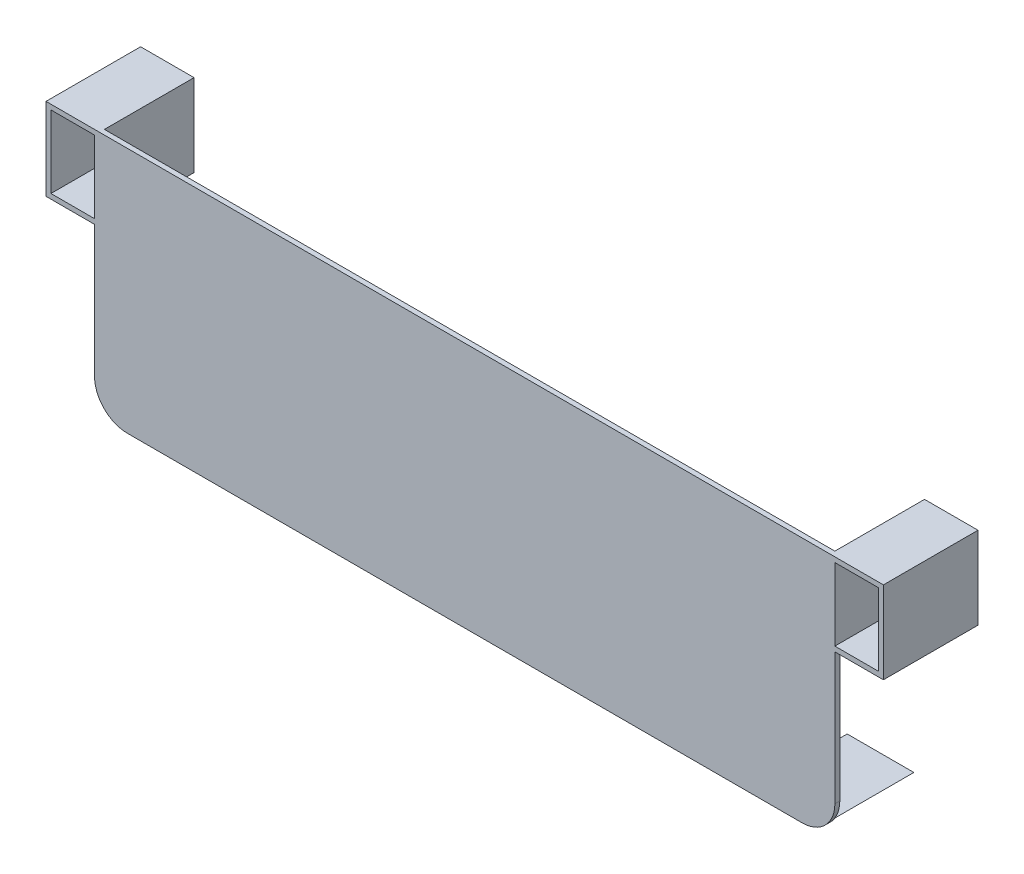
ISO-10303-21;
HEADER;
FILE_DESCRIPTION(('STEP AP214'),'2;1');
FILE_NAME('part.step','',(''),(''),'','','');
FILE_SCHEMA(('AUTOMOTIVE_DESIGN { 1 0 10303 214 1 1 1 1 }'));
ENDSEC;
DATA;
#1=APPLICATION_CONTEXT('core data for automotive mechanical design processes');
#2=APPLICATION_PROTOCOL_DEFINITION('international standard','automotive_design',2000,#1);
#3=PRODUCT_CONTEXT('',#1,'mechanical');
#4=PRODUCT('Part','Part','',(#3));
#5=PRODUCT_RELATED_PRODUCT_CATEGORY('part','',(#4));
#6=PRODUCT_DEFINITION_FORMATION('','',#4);
#7=PRODUCT_DEFINITION_CONTEXT('part definition',#1,'design');
#8=PRODUCT_DEFINITION('design','',#6,#7);
#9=PRODUCT_DEFINITION_SHAPE('','',#8);
#10=(LENGTH_UNIT() NAMED_UNIT(*) SI_UNIT(.MILLI.,.METRE.));
#11=(NAMED_UNIT(*) PLANE_ANGLE_UNIT() SI_UNIT($,.RADIAN.));
#12=(NAMED_UNIT(*) SI_UNIT($,.STERADIAN.) SOLID_ANGLE_UNIT());
#13=UNCERTAINTY_MEASURE_WITH_UNIT(LENGTH_MEASURE(1.E-05),#10,'distance_accuracy_value','');
#14=(GEOMETRIC_REPRESENTATION_CONTEXT(3) GLOBAL_UNCERTAINTY_ASSIGNED_CONTEXT((#13)) GLOBAL_UNIT_ASSIGNED_CONTEXT((#10,
#11,#12)) REPRESENTATION_CONTEXT('',''));
#15=CARTESIAN_POINT('',(0.,0.,0.));
#16=DIRECTION('',(0.,0.,1.));
#17=DIRECTION('',(1.,0.,0.));
#18=AXIS2_PLACEMENT_3D('',#15,#16,#17);
#19=CARTESIAN_POINT('',(-34.8472509170981,0.,1.2));
#20=DIRECTION('',(1.,0.,0.));
#21=DIRECTION('',(0.,1.,0.));
#22=AXIS2_PLACEMENT_3D('',#19,#20,#21);
#23=PLANE('',#22);
#24=DIRECTION('',(0.,-1.,0.));
#25=VECTOR('',#24,1.);
#26=CARTESIAN_POINT('',(-34.8472509170981,0.,1.2));
#27=LINE('',#26,#25);
#28=CARTESIAN_POINT('',(-34.8472509170981,46.7032258064516,1.2));
#29=VERTEX_POINT('',#28);
#30=CARTESIAN_POINT('',(-34.8472509170981,29.1032258064516,1.2));
#31=VERTEX_POINT('',#30);
#32=EDGE_CURVE('E386',#29,#31,#27,.T.);
#33=ORIENTED_EDGE('',*,*,#32,.T.);
#34=DIRECTION('',(0.,0.,1.));
#35=VECTOR('',#34,1.);
#36=CARTESIAN_POINT('',(-34.8472509170981,29.1032258064516,-21.8));
#37=LINE('',#36,#35);
#38=CARTESIAN_POINT('',(-34.8472509170981,29.1032258064516,-21.8));
#39=VERTEX_POINT('',#38);
#40=EDGE_CURVE('E276',#39,#31,#37,.T.);
#41=ORIENTED_EDGE('',*,*,#40,.F.);
#42=DIRECTION('',(0.,-1.,0.));
#43=VECTOR('',#42,1.);
#44=CARTESIAN_POINT('',(-34.8472509170981,46.7032258064516,-21.8));
#45=LINE('',#44,#43);
#46=CARTESIAN_POINT('',(-34.8472509170981,46.7032258064516,-21.8));
#47=VERTEX_POINT('',#46);
#48=EDGE_CURVE('E253',#47,#39,#45,.T.);
#49=ORIENTED_EDGE('',*,*,#48,.F.);
#50=DIRECTION('',(0.,0.,1.));
#51=VECTOR('',#50,1.);
#52=CARTESIAN_POINT('',(-34.8472509170981,46.7032258064516,-21.8));
#53=LINE('',#52,#51);
#54=EDGE_CURVE('E263',#47,#29,#53,.T.);
#55=ORIENTED_EDGE('',*,*,#54,.T.);
#56=EDGE_LOOP('',(#33,#41,#49,#55));
#57=FACE_BOUND('',#56,.T.);
#58=ADVANCED_FACE('F35',(#57),#23,.T.);
#59=CARTESIAN_POINT('',(-214.847250917098,0.,1.2));
#60=DIRECTION('',(1.,0.,0.));
#61=DIRECTION('',(0.,0.,-1.));
#62=AXIS2_PLACEMENT_3D('',#59,#60,#61);
#63=PLANE('',#62);
#64=DIRECTION('',(0.,-1.,0.));
#65=VECTOR('',#64,1.);
#66=CARTESIAN_POINT('',(-214.847250917098,0.,1.2));
#67=LINE('',#66,#65);
#68=CARTESIAN_POINT('',(-214.847250917098,46.7032258064516,1.2));
#69=VERTEX_POINT('',#68);
#70=CARTESIAN_POINT('',(-214.847250917098,29.1032258064516,1.2));
#71=VERTEX_POINT('',#70);
#72=EDGE_CURVE('E392',#69,#71,#67,.T.);
#73=ORIENTED_EDGE('',*,*,#72,.F.);
#74=DIRECTION('',(0.,0.,1.));
#75=VECTOR('',#74,1.);
#76=CARTESIAN_POINT('',(-214.847250917098,46.7032258064516,-21.8));
#77=LINE('',#76,#75);
#78=CARTESIAN_POINT('',(-214.847250917098,46.7032258064516,-21.8));
#79=VERTEX_POINT('',#78);
#80=EDGE_CURVE('E334',#79,#69,#77,.T.);
#81=ORIENTED_EDGE('',*,*,#80,.F.);
#82=DIRECTION('',(0.,1.,0.));
#83=VECTOR('',#82,1.);
#84=CARTESIAN_POINT('',(-214.847250917098,46.7032258064516,-21.8));
#85=LINE('',#84,#83);
#86=CARTESIAN_POINT('',(-214.847250917098,29.1032258064516,-21.8));
#87=VERTEX_POINT('',#86);
#88=EDGE_CURVE('E318',#87,#79,#85,.T.);
#89=ORIENTED_EDGE('',*,*,#88,.F.);
#90=DIRECTION('',(0.,0.,1.));
#91=VECTOR('',#90,1.);
#92=CARTESIAN_POINT('',(-214.847250917098,29.1032258064516,-21.8));
#93=LINE('',#92,#91);
#94=EDGE_CURVE('E336',#87,#71,#93,.T.);
#95=ORIENTED_EDGE('',*,*,#94,.T.);
#96=EDGE_LOOP('',(#73,#81,#89,#95));
#97=FACE_BOUND('',#96,.T.);
#98=ADVANCED_FACE('F505',(#97),#63,.F.);
#99=CARTESIAN_POINT('',(-34.8472509170981,27.9032258064516,1.2));
#100=VERTEX_POINT('',#99);
#101=CARTESIAN_POINT('',(-34.8472509170981,-4.09677419354839,1.2));
#102=VERTEX_POINT('',#101);
#103=EDGE_CURVE('E383',#100,#102,#27,.T.);
#104=ORIENTED_EDGE('',*,*,#103,.T.);
#105=DIRECTION('',(0.,0.,-1.));
#106=VECTOR('',#105,1.);
#107=CARTESIAN_POINT('',(-34.8472509170981,-4.09677419354839,-21.8));
#108=LINE('',#107,#106);
#109=CARTESIAN_POINT('',(-34.8472509170981,-4.09677419354839,0.));
#110=VERTEX_POINT('',#109);
#111=EDGE_CURVE('E423',#102,#110,#108,.T.);
#112=ORIENTED_EDGE('',*,*,#111,.T.);
#113=DIRECTION('',(0.,-1.,0.));
#114=VECTOR('',#113,1.);
#115=CARTESIAN_POINT('',(-34.8472509170981,0.,0.));
#116=LINE('',#115,#114);
#117=CARTESIAN_POINT('',(-34.8472509170981,27.9032258064516,0.));
#118=VERTEX_POINT('',#117);
#119=EDGE_CURVE('E381',#118,#110,#116,.T.);
#120=ORIENTED_EDGE('',*,*,#119,.F.);
#121=DIRECTION('',(0.,0.,-1.));
#122=VECTOR('',#121,1.);
#123=CARTESIAN_POINT('',(-34.8472509170981,27.9032258064516,1.2));
#124=LINE('',#123,#122);
#125=EDGE_CURVE('E299',#100,#118,#124,.T.);
#126=ORIENTED_EDGE('',*,*,#125,.F.);
#127=EDGE_LOOP('',(#104,#112,#120,#126));
#128=FACE_BOUND('',#127,.T.);
#129=ADVANCED_FACE('F468',(#128),#23,.T.);
#130=CARTESIAN_POINT('',(0.,47.9032258064516,1.2));
#131=DIRECTION('',(0.,1.,0.));
#132=DIRECTION('',(0.,0.,1.));
#133=AXIS2_PLACEMENT_3D('',#130,#131,#132);
#134=PLANE('',#133);
#135=DIRECTION('',(1.,0.,0.));
#136=VECTOR('',#135,1.);
#137=CARTESIAN_POINT('',(0.,47.9032258064516,1.2));
#138=LINE('',#137,#136);
#139=CARTESIAN_POINT('',(-226.647250917098,47.9032258064516,1.2));
#140=VERTEX_POINT('',#139);
#141=CARTESIAN_POINT('',(-23.0472509170981,47.9032258064516,1.2));
#142=VERTEX_POINT('',#141);
#143=EDGE_CURVE('E388',#140,#142,#138,.T.);
#144=ORIENTED_EDGE('',*,*,#143,.T.);
#145=DIRECTION('',(0.,0.,1.));
#146=VECTOR('',#145,1.);
#147=CARTESIAN_POINT('',(-23.0472509170981,47.9032258064516,-21.8));
#148=LINE('',#147,#146);
#149=CARTESIAN_POINT('',(-23.0472509170981,47.9032258064516,-21.8));
#150=VERTEX_POINT('',#149);
#151=EDGE_CURVE('E296',#150,#142,#148,.T.);
#152=ORIENTED_EDGE('',*,*,#151,.F.);
#153=DIRECTION('',(-1.,0.,0.));
#154=VECTOR('',#153,1.);
#155=CARTESIAN_POINT('',(-36.0472509170981,47.9032258064516,-21.8));
#156=LINE('',#155,#154);
#157=CARTESIAN_POINT('',(-36.0472509170981,47.9032258064516,-21.8));
#158=VERTEX_POINT('',#157);
#159=EDGE_CURVE('E279',#150,#158,#156,.T.);
#160=ORIENTED_EDGE('',*,*,#159,.T.);
#161=DIRECTION('',(0.,0.,1.));
#162=VECTOR('',#161,1.);
#163=CARTESIAN_POINT('',(-36.0472509170981,47.9032258064516,-21.8));
#164=LINE('',#163,#162);
#165=CARTESIAN_POINT('',(-36.0472509170981,47.9032258064516,0.));
#166=VERTEX_POINT('',#165);
#167=EDGE_CURVE('E292',#158,#166,#164,.T.);
#168=ORIENTED_EDGE('',*,*,#167,.T.);
#169=DIRECTION('',(1.,0.,0.));
#170=VECTOR('',#169,1.);
#171=CARTESIAN_POINT('',(0.,47.9032258064516,0.));
#172=LINE('',#171,#170);
#173=CARTESIAN_POINT('',(-213.647250917098,47.9032258064516,0.));
#174=VERTEX_POINT('',#173);
#175=EDGE_CURVE('E399',#174,#166,#172,.T.);
#176=ORIENTED_EDGE('',*,*,#175,.F.);
#177=DIRECTION('',(0.,0.,1.));
#178=VECTOR('',#177,1.);
#179=CARTESIAN_POINT('',(-213.647250917098,47.9032258064516,-21.8));
#180=LINE('',#179,#178);
#181=CARTESIAN_POINT('',(-213.647250917098,47.9032258064516,-21.8));
#182=VERTEX_POINT('',#181);
#183=EDGE_CURVE('E353',#182,#174,#180,.T.);
#184=ORIENTED_EDGE('',*,*,#183,.F.);
#185=DIRECTION('',(-1.,0.,0.));
#186=VECTOR('',#185,1.);
#187=CARTESIAN_POINT('',(-213.647250917098,47.9032258064516,-21.8));
#188=LINE('',#187,#186);
#189=CARTESIAN_POINT('',(-226.647250917098,47.9032258064516,-21.8));
#190=VERTEX_POINT('',#189);
#191=EDGE_CURVE('E343',#182,#190,#188,.T.);
#192=ORIENTED_EDGE('',*,*,#191,.T.);
#193=DIRECTION('',(0.,0.,1.));
#194=VECTOR('',#193,1.);
#195=CARTESIAN_POINT('',(-226.647250917098,47.9032258064516,-21.8));
#196=LINE('',#195,#194);
#197=EDGE_CURVE('E364',#190,#140,#196,.T.);
#198=ORIENTED_EDGE('',*,*,#197,.T.);
#199=EDGE_LOOP('',(#144,#152,#160,#168,#176,#184,#192,#198));
#200=FACE_BOUND('',#199,.T.);
#201=ADVANCED_FACE('F479',(#200),#134,.T.);
#202=DIRECTION('',(0.,-1.,0.));
#203=VECTOR('',#202,1.);
#204=CARTESIAN_POINT('',(-214.847250917098,0.,0.));
#205=LINE('',#204,#203);
#206=CARTESIAN_POINT('',(-214.847250917098,27.9032258064516,0.));
#207=VERTEX_POINT('',#206);
#208=CARTESIAN_POINT('',(-214.847250917098,-4.09677419354839,0.));
#209=VERTEX_POINT('',#208);
#210=EDGE_CURVE('E401',#207,#209,#205,.T.);
#211=ORIENTED_EDGE('',*,*,#210,.T.);
#212=DIRECTION('',(0.,0.,-1.));
#213=VECTOR('',#212,1.);
#214=CARTESIAN_POINT('',(-214.847250917098,-4.09677419354839,1.2));
#215=LINE('',#214,#213);
#216=CARTESIAN_POINT('',(-214.847250917098,-4.09677419354839,1.2));
#217=VERTEX_POINT('',#216);
#218=EDGE_CURVE('E11',#209,#217,#215,.F.);
#219=ORIENTED_EDGE('',*,*,#218,.T.);
#220=CARTESIAN_POINT('',(-214.847250917098,27.9032258064516,1.2));
#221=VERTEX_POINT('',#220);
#222=EDGE_CURVE('E390',#221,#217,#67,.T.);
#223=ORIENTED_EDGE('',*,*,#222,.F.);
#224=DIRECTION('',(0.,0.,-1.));
#225=VECTOR('',#224,1.);
#226=CARTESIAN_POINT('',(-214.847250917098,27.9032258064516,1.2));
#227=LINE('',#226,#225);
#228=EDGE_CURVE('E361',#221,#207,#227,.T.);
#229=ORIENTED_EDGE('',*,*,#228,.T.);
#230=EDGE_LOOP('',(#211,#219,#223,#229));
#231=FACE_BOUND('',#230,.T.);
#232=ADVANCED_FACE('F502',(#231),#63,.F.);
#233=CARTESIAN_POINT('',(0.,-12.0967741935484,1.2));
#234=DIRECTION('',(0.,1.,0.));
#235=DIRECTION('',(-1.,0.,0.));
#236=AXIS2_PLACEMENT_3D('',#233,#234,#235);
#237=PLANE('',#236);
#238=DIRECTION('',(1.,0.,0.));
#239=VECTOR('',#238,1.);
#240=CARTESIAN_POINT('',(-34.8472509170981,-12.0967741935484,-21.8));
#241=LINE('',#240,#239);
#242=CARTESIAN_POINT('',(-54.8472509170981,-12.0967741935484,-21.8));
#243=VERTEX_POINT('',#242);
#244=CARTESIAN_POINT('',(-42.8472509170981,-12.0967741935484,-21.8));
#245=VERTEX_POINT('',#244);
#246=EDGE_CURVE('E232',#243,#245,#241,.T.);
#247=ORIENTED_EDGE('',*,*,#246,.T.);
#248=DIRECTION('',(0.,0.,-1.));
#249=VECTOR('',#248,1.);
#250=CARTESIAN_POINT('',(-42.8472509170981,-12.0967741935484,1.2));
#251=LINE('',#250,#249);
#252=CARTESIAN_POINT('',(-42.8472509170981,-12.0967741935484,1.2));
#253=VERTEX_POINT('',#252);
#254=EDGE_CURVE('E436',#245,#253,#251,.F.);
#255=ORIENTED_EDGE('',*,*,#254,.T.);
#256=DIRECTION('',(1.,0.,0.));
#257=VECTOR('',#256,1.);
#258=CARTESIAN_POINT('',(0.,-12.0967741935484,1.2));
#259=LINE('',#258,#257);
#260=CARTESIAN_POINT('',(-206.847250917098,-12.0967741935484,1.2));
#261=VERTEX_POINT('',#260);
#262=EDGE_CURVE('E393',#261,#253,#259,.T.);
#263=ORIENTED_EDGE('',*,*,#262,.F.);
#264=DIRECTION('',(0.,0.,-1.));
#265=VECTOR('',#264,1.);
#266=CARTESIAN_POINT('',(-206.847250917098,-12.0967741935484,1.2));
#267=LINE('',#266,#265);
#268=CARTESIAN_POINT('',(-206.847250917098,-12.0967741935484,-21.8));
#269=VERTEX_POINT('',#268);
#270=EDGE_CURVE('E433',#261,#269,#267,.T.);
#271=ORIENTED_EDGE('',*,*,#270,.T.);
#272=DIRECTION('',(1.,0.,0.));
#273=VECTOR('',#272,1.);
#274=CARTESIAN_POINT('',(-214.847250917098,-12.0967741935484,-21.8));
#275=LINE('',#274,#273);
#276=CARTESIAN_POINT('',(-194.847250917098,-12.0967741935484,-21.8));
#277=VERTEX_POINT('',#276);
#278=EDGE_CURVE('E370',#269,#277,#275,.T.);
#279=ORIENTED_EDGE('',*,*,#278,.T.);
#280=DIRECTION('',(0.,0.,1.));
#281=VECTOR('',#280,1.);
#282=CARTESIAN_POINT('',(-194.847250917098,-12.0967741935484,-21.8));
#283=LINE('',#282,#281);
#284=CARTESIAN_POINT('',(-194.847250917098,-12.0967741935484,0.));
#285=VERTEX_POINT('',#284);
#286=EDGE_CURVE('E377',#277,#285,#283,.T.);
#287=ORIENTED_EDGE('',*,*,#286,.T.);
#288=DIRECTION('',(1.,0.,0.));
#289=VECTOR('',#288,1.);
#290=CARTESIAN_POINT('',(0.,-12.0967741935484,0.));
#291=LINE('',#290,#289);
#292=CARTESIAN_POINT('',(-54.8472509170981,-12.0967741935484,0.));
#293=VERTEX_POINT('',#292);
#294=EDGE_CURVE('E387',#285,#293,#291,.T.);
#295=ORIENTED_EDGE('',*,*,#294,.T.);
#296=DIRECTION('',(0.,0.,1.));
#297=VECTOR('',#296,1.);
#298=CARTESIAN_POINT('',(-54.8472509170981,-12.0967741935484,-21.8));
#299=LINE('',#298,#297);
#300=EDGE_CURVE('E240',#243,#293,#299,.T.);
#301=ORIENTED_EDGE('',*,*,#300,.F.);
#302=EDGE_LOOP('',(#247,#255,#263,#271,#279,#287,#295,#301));
#303=FACE_BOUND('',#302,.T.);
#304=ADVANCED_FACE('F460',(#303),#237,.F.);
#305=CARTESIAN_POINT('',(0.,0.,1.2));
#306=DIRECTION('',(0.,0.,1.));
#307=DIRECTION('',(1.,0.,0.));
#308=AXIS2_PLACEMENT_3D('',#305,#306,#307);
#309=PLANE('',#308);
#310=ORIENTED_EDGE('',*,*,#262,.T.);
#311=CARTESIAN_POINT('',(-42.8472509170981,-4.09677419354839,1.2));
#312=DIRECTION('',(0.,0.,1.));
#313=DIRECTION('',(1.,0.,0.));
#314=AXIS2_PLACEMENT_3D('',#311,#312,#313);
#315=CIRCLE('',#314,8.);
#316=EDGE_CURVE('E440',#253,#102,#315,.T.);
#317=ORIENTED_EDGE('',*,*,#316,.T.);
#318=ORIENTED_EDGE('',*,*,#103,.F.);
#319=DIRECTION('',(1.,0.,0.));
#320=VECTOR('',#319,1.);
#321=CARTESIAN_POINT('',(-36.0472509170981,27.9032258064516,1.2));
#322=LINE('',#321,#320);
#323=CARTESIAN_POINT('',(-23.0472509170981,27.9032258064516,1.2));
#324=VERTEX_POINT('',#323);
#325=EDGE_CURVE('E273',#100,#324,#322,.T.);
#326=ORIENTED_EDGE('',*,*,#325,.T.);
#327=DIRECTION('',(0.,1.,0.));
#328=VECTOR('',#327,1.);
#329=CARTESIAN_POINT('',(-23.0472509170981,47.9032258064516,1.2));
#330=LINE('',#329,#328);
#331=EDGE_CURVE('E283',#324,#142,#330,.T.);
#332=ORIENTED_EDGE('',*,*,#331,.T.);
#333=ORIENTED_EDGE('',*,*,#143,.F.);
#334=DIRECTION('',(0.,-1.,0.));
#335=VECTOR('',#334,1.);
#336=CARTESIAN_POINT('',(-226.647250917098,47.9032258064516,1.2));
#337=LINE('',#336,#335);
#338=CARTESIAN_POINT('',(-226.647250917098,27.9032258064516,1.2));
#339=VERTEX_POINT('',#338);
#340=EDGE_CURVE('E333',#140,#339,#337,.T.);
#341=ORIENTED_EDGE('',*,*,#340,.T.);
#342=DIRECTION('',(1.,0.,0.));
#343=VECTOR('',#342,1.);
#344=CARTESIAN_POINT('',(-213.647250917098,27.9032258064516,1.2));
#345=LINE('',#344,#343);
#346=EDGE_CURVE('E344',#339,#221,#345,.T.);
#347=ORIENTED_EDGE('',*,*,#346,.T.);
#348=ORIENTED_EDGE('',*,*,#222,.T.);
#349=CARTESIAN_POINT('',(-206.847250917098,-4.09677419354839,1.2));
#350=DIRECTION('',(0.,0.,1.));
#351=DIRECTION('',(1.,0.,0.));
#352=AXIS2_PLACEMENT_3D('',#349,#350,#351);
#353=CIRCLE('',#352,8.);
#354=EDGE_CURVE('E438',#217,#261,#353,.T.);
#355=ORIENTED_EDGE('',*,*,#354,.T.);
#356=EDGE_LOOP('',(#310,#317,#318,#326,#332,#333,#341,#347,#348,#355));
#357=FACE_BOUND('',#356,.T.);
#358=DIRECTION('',(1.,0.,0.));
#359=VECTOR('',#358,1.);
#360=CARTESIAN_POINT('',(-24.2472509170981,29.1032258064516,1.2));
#361=LINE('',#360,#359);
#362=CARTESIAN_POINT('',(-24.2472509170981,29.1032258064516,1.2));
#363=VERTEX_POINT('',#362);
#364=EDGE_CURVE('E266',#31,#363,#361,.T.);
#365=ORIENTED_EDGE('',*,*,#364,.F.);
#366=ORIENTED_EDGE('',*,*,#32,.F.);
#367=DIRECTION('',(-1.,0.,0.));
#368=VECTOR('',#367,1.);
#369=CARTESIAN_POINT('',(-24.2472509170981,46.7032258064516,1.2));
#370=LINE('',#369,#368);
#371=CARTESIAN_POINT('',(-24.2472509170981,46.7032258064516,1.2));
#372=VERTEX_POINT('',#371);
#373=EDGE_CURVE('E248',#372,#29,#370,.T.);
#374=ORIENTED_EDGE('',*,*,#373,.F.);
#375=DIRECTION('',(0.,1.,0.));
#376=VECTOR('',#375,1.);
#377=CARTESIAN_POINT('',(-24.2472509170981,46.7032258064516,1.2));
#378=LINE('',#377,#376);
#379=EDGE_CURVE('E254',#363,#372,#378,.T.);
#380=ORIENTED_EDGE('',*,*,#379,.F.);
#381=EDGE_LOOP('',(#365,#366,#374,#380));
#382=FACE_BOUND('',#381,.T.);
#383=ORIENTED_EDGE('',*,*,#72,.T.);
#384=DIRECTION('',(1.,0.,0.));
#385=VECTOR('',#384,1.);
#386=CARTESIAN_POINT('',(-225.447250917098,29.1032258064516,1.2));
#387=LINE('',#386,#385);
#388=CARTESIAN_POINT('',(-225.447250917098,29.1032258064516,1.2));
#389=VERTEX_POINT('',#388);
#390=EDGE_CURVE('E326',#389,#71,#387,.T.);
#391=ORIENTED_EDGE('',*,*,#390,.F.);
#392=DIRECTION('',(0.,-1.,0.));
#393=VECTOR('',#392,1.);
#394=CARTESIAN_POINT('',(-225.447250917098,46.7032258064516,1.2));
#395=LINE('',#394,#393);
#396=CARTESIAN_POINT('',(-225.447250917098,46.7032258064516,1.2));
#397=VERTEX_POINT('',#396);
#398=EDGE_CURVE('E310',#397,#389,#395,.T.);
#399=ORIENTED_EDGE('',*,*,#398,.F.);
#400=DIRECTION('',(-1.,0.,0.));
#401=VECTOR('',#400,1.);
#402=CARTESIAN_POINT('',(-225.447250917098,46.7032258064516,1.2));
#403=LINE('',#402,#401);
#404=EDGE_CURVE('E315',#69,#397,#403,.T.);
#405=ORIENTED_EDGE('',*,*,#404,.F.);
#406=EDGE_LOOP('',(#383,#391,#399,#405));
#407=FACE_BOUND('',#406,.T.);
#408=ADVANCED_FACE('F456',(#357,#382,#407),#309,.T.);
#409=CARTESIAN_POINT('',(0.,0.,0.));
#410=DIRECTION('',(0.,0.,1.));
#411=DIRECTION('',(1.,0.,0.));
#412=AXIS2_PLACEMENT_3D('',#409,#410,#411);
#413=PLANE('',#412);
#414=ORIENTED_EDGE('',*,*,#119,.T.);
#415=CARTESIAN_POINT('',(-42.8472509170981,-4.09677419354839,0.));
#416=DIRECTION('',(0.,0.,1.));
#417=DIRECTION('',(1.,0.,0.));
#418=AXIS2_PLACEMENT_3D('',#415,#416,#417);
#419=CIRCLE('',#418,8.);
#420=CARTESIAN_POINT('',(-38.632989415957,-10.8967741935484,0.));
#421=VERTEX_POINT('',#420);
#422=EDGE_CURVE('E428',#110,#421,#419,.F.);
#423=ORIENTED_EDGE('',*,*,#422,.T.);
#424=DIRECTION('',(-1.,0.,0.));
#425=VECTOR('',#424,1.);
#426=CARTESIAN_POINT('',(0.,-10.8967741935484,0.));
#427=LINE('',#426,#425);
#428=CARTESIAN_POINT('',(-54.8472509170981,-10.8967741935484,0.));
#429=VERTEX_POINT('',#428);
#430=EDGE_CURVE('E420',#421,#429,#427,.T.);
#431=ORIENTED_EDGE('',*,*,#430,.T.);
#432=DIRECTION('',(0.,-1.,0.));
#433=VECTOR('',#432,1.);
#434=CARTESIAN_POINT('',(-54.8472509170976,2.53719503356479E-12,0.));
#435=LINE('',#434,#433);
#436=EDGE_CURVE('E239',#429,#293,#435,.T.);
#437=ORIENTED_EDGE('',*,*,#436,.T.);
#438=ORIENTED_EDGE('',*,*,#294,.F.);
#439=DIRECTION('',(0.,1.,0.));
#440=VECTOR('',#439,1.);
#441=CARTESIAN_POINT('',(-194.847250917098,0.,0.));
#442=LINE('',#441,#440);
#443=CARTESIAN_POINT('',(-194.847250917098,-10.8967741935484,0.));
#444=VERTEX_POINT('',#443);
#445=EDGE_CURVE('E396',#285,#444,#442,.T.);
#446=ORIENTED_EDGE('',*,*,#445,.T.);
#447=DIRECTION('',(-1.,0.,0.));
#448=VECTOR('',#447,1.);
#449=CARTESIAN_POINT('',(0.,-10.8967741935484,0.));
#450=LINE('',#449,#448);
#451=CARTESIAN_POINT('',(-211.061512418239,-10.8967741935484,0.));
#452=VERTEX_POINT('',#451);
#453=EDGE_CURVE('E407',#444,#452,#450,.T.);
#454=ORIENTED_EDGE('',*,*,#453,.T.);
#455=CARTESIAN_POINT('',(-206.847250917098,-4.09677419354839,0.));
#456=DIRECTION('',(0.,0.,1.));
#457=DIRECTION('',(1.,0.,0.));
#458=AXIS2_PLACEMENT_3D('',#455,#456,#457);
#459=CIRCLE('',#458,8.);
#460=EDGE_CURVE('E426',#452,#209,#459,.F.);
#461=ORIENTED_EDGE('',*,*,#460,.T.);
#462=ORIENTED_EDGE('',*,*,#210,.F.);
#463=DIRECTION('',(1.,0.,0.));
#464=VECTOR('',#463,1.);
#465=CARTESIAN_POINT('',(0.,27.9032258064517,0.));
#466=LINE('',#465,#464);
#467=CARTESIAN_POINT('',(-213.647250917098,27.9032258064516,0.));
#468=VERTEX_POINT('',#467);
#469=EDGE_CURVE('E410',#207,#468,#466,.T.);
#470=ORIENTED_EDGE('',*,*,#469,.T.);
#471=DIRECTION('',(0.,1.,0.));
#472=VECTOR('',#471,1.);
#473=CARTESIAN_POINT('',(-213.647250917098,0.,0.));
#474=LINE('',#473,#472);
#475=EDGE_CURVE('E413',#468,#174,#474,.T.);
#476=ORIENTED_EDGE('',*,*,#475,.T.);
#477=ORIENTED_EDGE('',*,*,#175,.T.);
#478=DIRECTION('',(0.,-1.,0.));
#479=VECTOR('',#478,1.);
#480=CARTESIAN_POINT('',(-36.0472509170981,0.,0.));
#481=LINE('',#480,#479);
#482=CARTESIAN_POINT('',(-36.0472509170981,27.9032258064516,0.));
#483=VERTEX_POINT('',#482);
#484=EDGE_CURVE('E416',#166,#483,#481,.T.);
#485=ORIENTED_EDGE('',*,*,#484,.T.);
#486=DIRECTION('',(1.,0.,0.));
#487=VECTOR('',#486,1.);
#488=CARTESIAN_POINT('',(0.,27.9032258064516,0.));
#489=LINE('',#488,#487);
#490=EDGE_CURVE('E418',#483,#118,#489,.T.);
#491=ORIENTED_EDGE('',*,*,#490,.T.);
#492=EDGE_LOOP('',(#414,#423,#431,#437,#438,#446,#454,#461,#462,#470,#476,#477,#485,#491));
#493=FACE_BOUND('',#492,.T.);
#494=ADVANCED_FACE('F448',(#493),#413,.F.);
#495=CARTESIAN_POINT('',(-214.847250917098,-10.8967741935484,-21.8));
#496=DIRECTION('',(0.,1.,0.));
#497=DIRECTION('',(0.,0.,1.));
#498=AXIS2_PLACEMENT_3D('',#495,#496,#497);
#499=PLANE('',#498);
#500=DIRECTION('',(-1.,0.,0.));
#501=VECTOR('',#500,1.);
#502=CARTESIAN_POINT('',(-214.847250917098,-10.8967741935484,-21.8));
#503=LINE('',#502,#501);
#504=CARTESIAN_POINT('',(-194.847250917098,-10.8967741935484,-21.8));
#505=VERTEX_POINT('',#504);
#506=CARTESIAN_POINT('',(-211.061512418239,-10.8967741935484,-21.8));
#507=VERTEX_POINT('',#506);
#508=EDGE_CURVE('E375',#505,#507,#503,.T.);
#509=ORIENTED_EDGE('',*,*,#508,.T.);
#510=DIRECTION('',(0.,0.,-1.));
#511=VECTOR('',#510,1.);
#512=CARTESIAN_POINT('',(-211.061512418239,-10.8967741935484,-21.8));
#513=LINE('',#512,#511);
#514=EDGE_CURVE('E43',#507,#452,#513,.F.);
#515=ORIENTED_EDGE('',*,*,#514,.T.);
#516=ORIENTED_EDGE('',*,*,#453,.F.);
#517=DIRECTION('',(0.,0.,1.));
#518=VECTOR('',#517,1.);
#519=CARTESIAN_POINT('',(-194.847250917098,-10.8967741935484,-21.8));
#520=LINE('',#519,#518);
#521=EDGE_CURVE('E378',#505,#444,#520,.T.);
#522=ORIENTED_EDGE('',*,*,#521,.F.);
#523=EDGE_LOOP('',(#509,#515,#516,#522));
#524=FACE_BOUND('',#523,.T.);
#525=ADVANCED_FACE('F444',(#524),#499,.T.);
#526=CARTESIAN_POINT('',(-194.847250917098,-12.0967741935484,-21.8));
#527=DIRECTION('',(1.,0.,0.));
#528=DIRECTION('',(0.,0.,-1.));
#529=AXIS2_PLACEMENT_3D('',#526,#527,#528);
#530=PLANE('',#529);
#531=ORIENTED_EDGE('',*,*,#445,.F.);
#532=ORIENTED_EDGE('',*,*,#286,.F.);
#533=DIRECTION('',(0.,1.,0.));
#534=VECTOR('',#533,1.);
#535=CARTESIAN_POINT('',(-194.847250917098,-12.0967741935484,-21.8));
#536=LINE('',#535,#534);
#537=EDGE_CURVE('E372',#277,#505,#536,.T.);
#538=ORIENTED_EDGE('',*,*,#537,.T.);
#539=ORIENTED_EDGE('',*,*,#521,.T.);
#540=EDGE_LOOP('',(#531,#532,#538,#539));
#541=FACE_BOUND('',#540,.T.);
#542=ADVANCED_FACE('F539',(#541),#530,.T.);
#543=CARTESIAN_POINT('',(0.,0.,-21.8));
#544=DIRECTION('',(0.,0.,-1.));
#545=DIRECTION('',(-1.,0.,0.));
#546=AXIS2_PLACEMENT_3D('',#543,#544,#545);
#547=PLANE('',#546);
#548=ORIENTED_EDGE('',*,*,#278,.F.);
#549=CARTESIAN_POINT('',(-206.847250917098,-4.09677419354839,-21.8));
#550=DIRECTION('',(0.,0.,-1.));
#551=DIRECTION('',(-1.,0.,0.));
#552=AXIS2_PLACEMENT_3D('',#549,#550,#551);
#553=CIRCLE('',#552,8.);
#554=EDGE_CURVE('E50',#269,#507,#553,.T.);
#555=ORIENTED_EDGE('',*,*,#554,.T.);
#556=ORIENTED_EDGE('',*,*,#508,.F.);
#557=ORIENTED_EDGE('',*,*,#537,.F.);
#558=EDGE_LOOP('',(#548,#555,#556,#557));
#559=FACE_BOUND('',#558,.T.);
#560=ADVANCED_FACE('F544',(#559),#547,.T.);
#561=CARTESIAN_POINT('',(-213.647250917098,47.9032258064516,-21.8));
#562=DIRECTION('',(1.,0.,0.));
#563=DIRECTION('',(0.,0.,-1.));
#564=AXIS2_PLACEMENT_3D('',#561,#562,#563);
#565=PLANE('',#564);
#566=ORIENTED_EDGE('',*,*,#475,.F.);
#567=DIRECTION('',(0.,0.,1.));
#568=VECTOR('',#567,1.);
#569=CARTESIAN_POINT('',(-213.647250917098,27.9032258064516,-21.8));
#570=LINE('',#569,#568);
#571=CARTESIAN_POINT('',(-213.647250917098,27.9032258064516,-21.8));
#572=VERTEX_POINT('',#571);
#573=EDGE_CURVE('E358',#572,#468,#570,.T.);
#574=ORIENTED_EDGE('',*,*,#573,.F.);
#575=DIRECTION('',(0.,1.,0.));
#576=VECTOR('',#575,1.);
#577=CARTESIAN_POINT('',(-213.647250917098,47.9032258064516,-21.8));
#578=LINE('',#577,#576);
#579=EDGE_CURVE('E340',#572,#182,#578,.T.);
#580=ORIENTED_EDGE('',*,*,#579,.T.);
#581=ORIENTED_EDGE('',*,*,#183,.T.);
#582=EDGE_LOOP('',(#566,#574,#580,#581));
#583=FACE_BOUND('',#582,.T.);
#584=ADVANCED_FACE('F490',(#583),#565,.T.);
#585=CARTESIAN_POINT('',(-213.647250917098,27.9032258064516,-21.8));
#586=DIRECTION('',(0.,-1.,0.));
#587=DIRECTION('',(1.,0.,0.));
#588=AXIS2_PLACEMENT_3D('',#585,#586,#587);
#589=PLANE('',#588);
#590=ORIENTED_EDGE('',*,*,#228,.F.);
#591=ORIENTED_EDGE('',*,*,#346,.F.);
#592=DIRECTION('',(0.,0.,1.));
#593=VECTOR('',#592,1.);
#594=CARTESIAN_POINT('',(-226.647250917098,27.9032258064516,-21.8));
#595=LINE('',#594,#593);
#596=CARTESIAN_POINT('',(-226.647250917098,27.9032258064516,-21.8));
#597=VERTEX_POINT('',#596);
#598=EDGE_CURVE('E362',#597,#339,#595,.T.);
#599=ORIENTED_EDGE('',*,*,#598,.F.);
#600=DIRECTION('',(1.,0.,0.));
#601=VECTOR('',#600,1.);
#602=CARTESIAN_POINT('',(-213.647250917098,27.9032258064516,-21.8));
#603=LINE('',#602,#601);
#604=EDGE_CURVE('E350',#597,#572,#603,.T.);
#605=ORIENTED_EDGE('',*,*,#604,.T.);
#606=ORIENTED_EDGE('',*,*,#573,.T.);
#607=ORIENTED_EDGE('',*,*,#469,.F.);
#608=EDGE_LOOP('',(#590,#591,#599,#605,#606,#607));
#609=FACE_BOUND('',#608,.T.);
#610=ADVANCED_FACE('F493',(#609),#589,.T.);
#611=CARTESIAN_POINT('',(-226.647250917098,47.9032258064516,-21.8));
#612=DIRECTION('',(-1.,0.,0.));
#613=DIRECTION('',(0.,-1.,0.));
#614=AXIS2_PLACEMENT_3D('',#611,#612,#613);
#615=PLANE('',#614);
#616=ORIENTED_EDGE('',*,*,#340,.F.);
#617=ORIENTED_EDGE('',*,*,#197,.F.);
#618=DIRECTION('',(0.,-1.,0.));
#619=VECTOR('',#618,1.);
#620=CARTESIAN_POINT('',(-226.647250917098,47.9032258064516,-21.8));
#621=LINE('',#620,#619);
#622=EDGE_CURVE('E347',#190,#597,#621,.T.);
#623=ORIENTED_EDGE('',*,*,#622,.T.);
#624=ORIENTED_EDGE('',*,*,#598,.T.);
#625=EDGE_LOOP('',(#616,#617,#623,#624));
#626=FACE_BOUND('',#625,.T.);
#627=ADVANCED_FACE('F501',(#626),#615,.T.);
#628=CARTESIAN_POINT('',(0.,0.,-21.8));
#629=DIRECTION('',(0.,0.,-1.));
#630=DIRECTION('',(-1.,0.,0.));
#631=AXIS2_PLACEMENT_3D('',#628,#629,#630);
#632=PLANE('',#631);
#633=DIRECTION('',(0.,-1.,0.));
#634=VECTOR('',#633,1.);
#635=CARTESIAN_POINT('',(-225.447250917098,46.7032258064516,-21.8));
#636=LINE('',#635,#634);
#637=CARTESIAN_POINT('',(-225.447250917098,46.7032258064516,-21.8));
#638=VERTEX_POINT('',#637);
#639=CARTESIAN_POINT('',(-225.447250917098,29.1032258064516,-21.8));
#640=VERTEX_POINT('',#639);
#641=EDGE_CURVE('E311',#638,#640,#636,.T.);
#642=ORIENTED_EDGE('',*,*,#641,.T.);
#643=DIRECTION('',(1.,0.,0.));
#644=VECTOR('',#643,1.);
#645=CARTESIAN_POINT('',(-225.447250917098,29.1032258064516,-21.8));
#646=LINE('',#645,#644);
#647=EDGE_CURVE('E314',#640,#87,#646,.T.);
#648=ORIENTED_EDGE('',*,*,#647,.T.);
#649=ORIENTED_EDGE('',*,*,#88,.T.);
#650=DIRECTION('',(-1.,0.,0.));
#651=VECTOR('',#650,1.);
#652=CARTESIAN_POINT('',(-225.447250917098,46.7032258064516,-21.8));
#653=LINE('',#652,#651);
#654=EDGE_CURVE('E321',#79,#638,#653,.T.);
#655=ORIENTED_EDGE('',*,*,#654,.T.);
#656=EDGE_LOOP('',(#642,#648,#649,#655));
#657=FACE_BOUND('',#656,.T.);
#658=ORIENTED_EDGE('',*,*,#579,.F.);
#659=ORIENTED_EDGE('',*,*,#604,.F.);
#660=ORIENTED_EDGE('',*,*,#622,.F.);
#661=ORIENTED_EDGE('',*,*,#191,.F.);
#662=EDGE_LOOP('',(#658,#659,#660,#661));
#663=FACE_BOUND('',#662,.T.);
#664=ADVANCED_FACE('F498',(#657,#663),#632,.T.);
#665=CARTESIAN_POINT('',(-225.447250917098,46.7032258064516,-21.8));
#666=DIRECTION('',(-1.,0.,0.));
#667=DIRECTION('',(0.,0.,1.));
#668=AXIS2_PLACEMENT_3D('',#665,#666,#667);
#669=PLANE('',#668);
#670=ORIENTED_EDGE('',*,*,#398,.T.);
#671=DIRECTION('',(0.,0.,1.));
#672=VECTOR('',#671,1.);
#673=CARTESIAN_POINT('',(-225.447250917098,29.1032258064516,-21.8));
#674=LINE('',#673,#672);
#675=EDGE_CURVE('E324',#640,#389,#674,.T.);
#676=ORIENTED_EDGE('',*,*,#675,.F.);
#677=ORIENTED_EDGE('',*,*,#641,.F.);
#678=DIRECTION('',(0.,0.,1.));
#679=VECTOR('',#678,1.);
#680=CARTESIAN_POINT('',(-225.447250917098,46.7032258064516,-21.8));
#681=LINE('',#680,#679);
#682=EDGE_CURVE('E331',#638,#397,#681,.T.);
#683=ORIENTED_EDGE('',*,*,#682,.T.);
#684=EDGE_LOOP('',(#670,#676,#677,#683));
#685=FACE_BOUND('',#684,.T.);
#686=ADVANCED_FACE('F582',(#685),#669,.F.);
#687=CARTESIAN_POINT('',(-225.447250917098,46.7032258064516,-21.8));
#688=DIRECTION('',(0.,1.,0.));
#689=DIRECTION('',(0.,0.,1.));
#690=AXIS2_PLACEMENT_3D('',#687,#688,#689);
#691=PLANE('',#690);
#692=ORIENTED_EDGE('',*,*,#404,.T.);
#693=ORIENTED_EDGE('',*,*,#682,.F.);
#694=ORIENTED_EDGE('',*,*,#654,.F.);
#695=ORIENTED_EDGE('',*,*,#80,.T.);
#696=EDGE_LOOP('',(#692,#693,#694,#695));
#697=FACE_BOUND('',#696,.T.);
#698=ADVANCED_FACE('F592',(#697),#691,.F.);
#699=CARTESIAN_POINT('',(-225.447250917098,29.1032258064516,-21.8));
#700=DIRECTION('',(0.,-1.,0.));
#701=DIRECTION('',(0.,0.,-1.));
#702=AXIS2_PLACEMENT_3D('',#699,#700,#701);
#703=PLANE('',#702);
#704=ORIENTED_EDGE('',*,*,#390,.T.);
#705=ORIENTED_EDGE('',*,*,#94,.F.);
#706=ORIENTED_EDGE('',*,*,#647,.F.);
#707=ORIENTED_EDGE('',*,*,#675,.T.);
#708=EDGE_LOOP('',(#704,#705,#706,#707));
#709=FACE_BOUND('',#708,.T.);
#710=ADVANCED_FACE('F602',(#709),#703,.F.);
#711=CARTESIAN_POINT('',(-36.0472509170981,47.9032258064516,-21.8));
#712=DIRECTION('',(-1.,0.,0.));
#713=DIRECTION('',(0.,0.,1.));
#714=AXIS2_PLACEMENT_3D('',#711,#712,#713);
#715=PLANE('',#714);
#716=ORIENTED_EDGE('',*,*,#484,.F.);
#717=ORIENTED_EDGE('',*,*,#167,.F.);
#718=DIRECTION('',(0.,-1.,0.));
#719=VECTOR('',#718,1.);
#720=CARTESIAN_POINT('',(-36.0472509170981,47.9032258064516,-21.8));
#721=LINE('',#720,#719);
#722=CARTESIAN_POINT('',(-36.0472509170981,27.9032258064516,-21.8));
#723=VERTEX_POINT('',#722);
#724=EDGE_CURVE('E282',#158,#723,#721,.T.);
#725=ORIENTED_EDGE('',*,*,#724,.T.);
#726=DIRECTION('',(0.,0.,1.));
#727=VECTOR('',#726,1.);
#728=CARTESIAN_POINT('',(-36.0472509170981,27.9032258064516,-21.8));
#729=LINE('',#728,#727);
#730=EDGE_CURVE('E303',#723,#483,#729,.T.);
#731=ORIENTED_EDGE('',*,*,#730,.T.);
#732=EDGE_LOOP('',(#716,#717,#725,#731));
#733=FACE_BOUND('',#732,.T.);
#734=ADVANCED_FACE('F486',(#733),#715,.T.);
#735=CARTESIAN_POINT('',(-23.0472509170981,47.9032258064516,-21.8));
#736=DIRECTION('',(1.,0.,0.));
#737=DIRECTION('',(0.,1.,0.));
#738=AXIS2_PLACEMENT_3D('',#735,#736,#737);
#739=PLANE('',#738);
#740=ORIENTED_EDGE('',*,*,#331,.F.);
#741=DIRECTION('',(0.,0.,1.));
#742=VECTOR('',#741,1.);
#743=CARTESIAN_POINT('',(-23.0472509170981,27.9032258064516,-21.8));
#744=LINE('',#743,#742);
#745=CARTESIAN_POINT('',(-23.0472509170981,27.9032258064516,-21.8));
#746=VERTEX_POINT('',#745);
#747=EDGE_CURVE('E300',#746,#324,#744,.T.);
#748=ORIENTED_EDGE('',*,*,#747,.F.);
#749=DIRECTION('',(0.,1.,0.));
#750=VECTOR('',#749,1.);
#751=CARTESIAN_POINT('',(-23.0472509170981,47.9032258064516,-21.8));
#752=LINE('',#751,#750);
#753=EDGE_CURVE('E289',#746,#150,#752,.T.);
#754=ORIENTED_EDGE('',*,*,#753,.T.);
#755=ORIENTED_EDGE('',*,*,#151,.T.);
#756=EDGE_LOOP('',(#740,#748,#754,#755));
#757=FACE_BOUND('',#756,.T.);
#758=ADVANCED_FACE('F475',(#757),#739,.T.);
#759=CARTESIAN_POINT('',(-36.0472509170981,27.9032258064516,-21.8));
#760=DIRECTION('',(0.,-1.,0.));
#761=DIRECTION('',(1.,0.,0.));
#762=AXIS2_PLACEMENT_3D('',#759,#760,#761);
#763=PLANE('',#762);
#764=ORIENTED_EDGE('',*,*,#325,.F.);
#765=ORIENTED_EDGE('',*,*,#125,.T.);
#766=ORIENTED_EDGE('',*,*,#490,.F.);
#767=ORIENTED_EDGE('',*,*,#730,.F.);
#768=DIRECTION('',(1.,0.,0.));
#769=VECTOR('',#768,1.);
#770=CARTESIAN_POINT('',(-36.0472509170981,27.9032258064516,-21.8));
#771=LINE('',#770,#769);
#772=EDGE_CURVE('E286',#723,#746,#771,.T.);
#773=ORIENTED_EDGE('',*,*,#772,.T.);
#774=ORIENTED_EDGE('',*,*,#747,.T.);
#775=EDGE_LOOP('',(#764,#765,#766,#767,#773,#774));
#776=FACE_BOUND('',#775,.T.);
#777=ADVANCED_FACE('F472',(#776),#763,.T.);
#778=CARTESIAN_POINT('',(0.,0.,-21.8));
#779=DIRECTION('',(0.,0.,-1.));
#780=DIRECTION('',(-1.,0.,0.));
#781=AXIS2_PLACEMENT_3D('',#778,#779,#780);
#782=PLANE('',#781);
#783=DIRECTION('',(-1.,0.,0.));
#784=VECTOR('',#783,1.);
#785=CARTESIAN_POINT('',(-24.2472509170981,46.7032258064516,-21.8));
#786=LINE('',#785,#784);
#787=CARTESIAN_POINT('',(-24.2472509170981,46.7032258064516,-21.8));
#788=VERTEX_POINT('',#787);
#789=EDGE_CURVE('E250',#788,#47,#786,.T.);
#790=ORIENTED_EDGE('',*,*,#789,.T.);
#791=ORIENTED_EDGE('',*,*,#48,.T.);
#792=DIRECTION('',(1.,0.,0.));
#793=VECTOR('',#792,1.);
#794=CARTESIAN_POINT('',(-24.2472509170981,29.1032258064516,-21.8));
#795=LINE('',#794,#793);
#796=CARTESIAN_POINT('',(-24.2472509170981,29.1032258064516,-21.8));
#797=VERTEX_POINT('',#796);
#798=EDGE_CURVE('E257',#39,#797,#795,.T.);
#799=ORIENTED_EDGE('',*,*,#798,.T.);
#800=DIRECTION('',(0.,1.,0.));
#801=VECTOR('',#800,1.);
#802=CARTESIAN_POINT('',(-24.2472509170981,46.7032258064516,-21.8));
#803=LINE('',#802,#801);
#804=EDGE_CURVE('E260',#797,#788,#803,.T.);
#805=ORIENTED_EDGE('',*,*,#804,.T.);
#806=EDGE_LOOP('',(#790,#791,#799,#805));
#807=FACE_BOUND('',#806,.T.);
#808=ORIENTED_EDGE('',*,*,#159,.F.);
#809=ORIENTED_EDGE('',*,*,#753,.F.);
#810=ORIENTED_EDGE('',*,*,#772,.F.);
#811=ORIENTED_EDGE('',*,*,#724,.F.);
#812=EDGE_LOOP('',(#808,#809,#810,#811));
#813=FACE_BOUND('',#812,.T.);
#814=ADVANCED_FACE('F482',(#807,#813),#782,.T.);
#815=CARTESIAN_POINT('',(-24.2472509170981,46.7032258064516,-21.8));
#816=DIRECTION('',(0.,1.,0.));
#817=DIRECTION('',(0.,0.,1.));
#818=AXIS2_PLACEMENT_3D('',#815,#816,#817);
#819=PLANE('',#818);
#820=ORIENTED_EDGE('',*,*,#373,.T.);
#821=ORIENTED_EDGE('',*,*,#54,.F.);
#822=ORIENTED_EDGE('',*,*,#789,.F.);
#823=DIRECTION('',(0.,0.,1.));
#824=VECTOR('',#823,1.);
#825=CARTESIAN_POINT('',(-24.2472509170981,46.7032258064516,-21.8));
#826=LINE('',#825,#824);
#827=EDGE_CURVE('E271',#788,#372,#826,.T.);
#828=ORIENTED_EDGE('',*,*,#827,.T.);
#829=EDGE_LOOP('',(#820,#821,#822,#828));
#830=FACE_BOUND('',#829,.T.);
#831=ADVANCED_FACE('F645',(#830),#819,.F.);
#832=CARTESIAN_POINT('',(-24.2472509170981,46.7032258064516,-21.8));
#833=DIRECTION('',(1.,0.,0.));
#834=DIRECTION('',(0.,0.,-1.));
#835=AXIS2_PLACEMENT_3D('',#832,#833,#834);
#836=PLANE('',#835);
#837=ORIENTED_EDGE('',*,*,#379,.T.);
#838=ORIENTED_EDGE('',*,*,#827,.F.);
#839=ORIENTED_EDGE('',*,*,#804,.F.);
#840=DIRECTION('',(0.,0.,1.));
#841=VECTOR('',#840,1.);
#842=CARTESIAN_POINT('',(-24.2472509170981,29.1032258064516,-21.8));
#843=LINE('',#842,#841);
#844=EDGE_CURVE('E274',#797,#363,#843,.T.);
#845=ORIENTED_EDGE('',*,*,#844,.T.);
#846=EDGE_LOOP('',(#837,#838,#839,#845));
#847=FACE_BOUND('',#846,.T.);
#848=ADVANCED_FACE('F655',(#847),#836,.F.);
#849=CARTESIAN_POINT('',(-24.2472509170981,29.1032258064516,-21.8));
#850=DIRECTION('',(0.,-1.,0.));
#851=DIRECTION('',(0.,0.,-1.));
#852=AXIS2_PLACEMENT_3D('',#849,#850,#851);
#853=PLANE('',#852);
#854=ORIENTED_EDGE('',*,*,#364,.T.);
#855=ORIENTED_EDGE('',*,*,#844,.F.);
#856=ORIENTED_EDGE('',*,*,#798,.F.);
#857=ORIENTED_EDGE('',*,*,#40,.T.);
#858=EDGE_LOOP('',(#854,#855,#856,#857));
#859=FACE_BOUND('',#858,.T.);
#860=ADVANCED_FACE('F665',(#859),#853,.F.);
#861=CARTESIAN_POINT('',(-54.8472509170981,-12.0967741935484,-21.8));
#862=DIRECTION('',(-1.,0.,0.));
#863=DIRECTION('',(0.,-1.,0.));
#864=AXIS2_PLACEMENT_3D('',#861,#862,#863);
#865=PLANE('',#864);
#866=ORIENTED_EDGE('',*,*,#436,.F.);
#867=DIRECTION('',(0.,0.,1.));
#868=VECTOR('',#867,1.);
#869=CARTESIAN_POINT('',(-54.8472509170981,-10.8967741935484,-21.8));
#870=LINE('',#869,#868);
#871=CARTESIAN_POINT('',(-54.8472509170981,-10.8967741935484,-21.8));
#872=VERTEX_POINT('',#871);
#873=EDGE_CURVE('E225',#872,#429,#870,.T.);
#874=ORIENTED_EDGE('',*,*,#873,.F.);
#875=DIRECTION('',(0.,-1.,0.));
#876=VECTOR('',#875,1.);
#877=CARTESIAN_POINT('',(-54.8472509170981,-12.0967741935484,-21.8));
#878=LINE('',#877,#876);
#879=EDGE_CURVE('E231',#872,#243,#878,.T.);
#880=ORIENTED_EDGE('',*,*,#879,.T.);
#881=ORIENTED_EDGE('',*,*,#300,.T.);
#882=EDGE_LOOP('',(#866,#874,#880,#881));
#883=FACE_BOUND('',#882,.T.);
#884=ADVANCED_FACE('F237',(#883),#865,.T.);
#885=CARTESIAN_POINT('',(-34.8472509170981,-10.8967741935484,-21.8));
#886=DIRECTION('',(0.,1.,0.));
#887=DIRECTION('',(0.,0.,1.));
#888=AXIS2_PLACEMENT_3D('',#885,#886,#887);
#889=PLANE('',#888);
#890=ORIENTED_EDGE('',*,*,#430,.F.);
#891=DIRECTION('',(0.,0.,1.));
#892=VECTOR('',#891,1.);
#893=CARTESIAN_POINT('',(-38.632989415957,-10.8967741935484,0.));
#894=LINE('',#893,#892);
#895=CARTESIAN_POINT('',(-38.632989415957,-10.8967741935484,-21.8));
#896=VERTEX_POINT('',#895);
#897=EDGE_CURVE('E227',#421,#896,#894,.F.);
#898=ORIENTED_EDGE('',*,*,#897,.T.);
#899=DIRECTION('',(-1.,0.,0.));
#900=VECTOR('',#899,1.);
#901=CARTESIAN_POINT('',(-34.8472509170981,-10.8967741935484,-21.8));
#902=LINE('',#901,#900);
#903=EDGE_CURVE('E221',#896,#872,#902,.T.);
#904=ORIENTED_EDGE('',*,*,#903,.T.);
#905=ORIENTED_EDGE('',*,*,#873,.T.);
#906=EDGE_LOOP('',(#890,#898,#904,#905));
#907=FACE_BOUND('',#906,.T.);
#908=ADVANCED_FACE('F224',(#907),#889,.T.);
#909=CARTESIAN_POINT('',(0.,0.,-21.8));
#910=DIRECTION('',(0.,0.,-1.));
#911=DIRECTION('',(-1.,0.,0.));
#912=AXIS2_PLACEMENT_3D('',#909,#910,#911);
#913=PLANE('',#912);
#914=ORIENTED_EDGE('',*,*,#903,.F.);
#915=CARTESIAN_POINT('',(-42.8472509170981,-4.09677419354839,-21.8));
#916=DIRECTION('',(0.,0.,-1.));
#917=DIRECTION('',(-1.,0.,0.));
#918=AXIS2_PLACEMENT_3D('',#915,#916,#917);
#919=CIRCLE('',#918,8.);
#920=EDGE_CURVE('E431',#896,#245,#919,.T.);
#921=ORIENTED_EDGE('',*,*,#920,.T.);
#922=ORIENTED_EDGE('',*,*,#246,.F.);
#923=ORIENTED_EDGE('',*,*,#879,.F.);
#924=EDGE_LOOP('',(#914,#921,#922,#923));
#925=FACE_BOUND('',#924,.T.);
#926=ADVANCED_FACE('F243',(#925),#913,.T.);
#927=CARTESIAN_POINT('',(-42.8472509170981,-4.09677419354839,1.2));
#928=DIRECTION('',(0.,0.,1.));
#929=DIRECTION('',(1.,0.,0.));
#930=AXIS2_PLACEMENT_3D('',#927,#928,#929);
#931=CYLINDRICAL_SURFACE('',#930,8.);
#932=ORIENTED_EDGE('',*,*,#316,.F.);
#933=ORIENTED_EDGE('',*,*,#254,.F.);
#934=ORIENTED_EDGE('',*,*,#920,.F.);
#935=ORIENTED_EDGE('',*,*,#897,.F.);
#936=ORIENTED_EDGE('',*,*,#422,.F.);
#937=ORIENTED_EDGE('',*,*,#111,.F.);
#938=EDGE_LOOP('',(#932,#933,#934,#935,#936,#937));
#939=FACE_BOUND('',#938,.T.);
#940=ADVANCED_FACE('F463',(#939),#931,.T.);
#941=CARTESIAN_POINT('',(-206.847250917098,-4.09677419354839,1.2));
#942=DIRECTION('',(0.,0.,-1.));
#943=DIRECTION('',(-1.,0.,0.));
#944=AXIS2_PLACEMENT_3D('',#941,#942,#943);
#945=CYLINDRICAL_SURFACE('',#944,8.);
#946=ORIENTED_EDGE('',*,*,#354,.F.);
#947=ORIENTED_EDGE('',*,*,#218,.F.);
#948=ORIENTED_EDGE('',*,*,#460,.F.);
#949=ORIENTED_EDGE('',*,*,#514,.F.);
#950=ORIENTED_EDGE('',*,*,#554,.F.);
#951=ORIENTED_EDGE('',*,*,#270,.F.);
#952=EDGE_LOOP('',(#946,#947,#948,#949,#950,#951));
#953=FACE_BOUND('',#952,.T.);
#954=ADVANCED_FACE('F37',(#953),#945,.T.);
#955=CLOSED_SHELL('',(#58,#98,#129,#201,#232,#304,#408,#494,#525,#542,#560,#584,#610,#627,#664,
#686,#698,#710,#734,#758,#777,#814,#831,#848,#860,#884,#908,#926,#940,#954));
#956=MANIFOLD_SOLID_BREP('B2',#955);
#957=ADVANCED_BREP_SHAPE_REPRESENTATION('',(#18,#956),#14);
#958=SHAPE_DEFINITION_REPRESENTATION(#9,#957);
ENDSEC;
END-ISO-10303-21;
